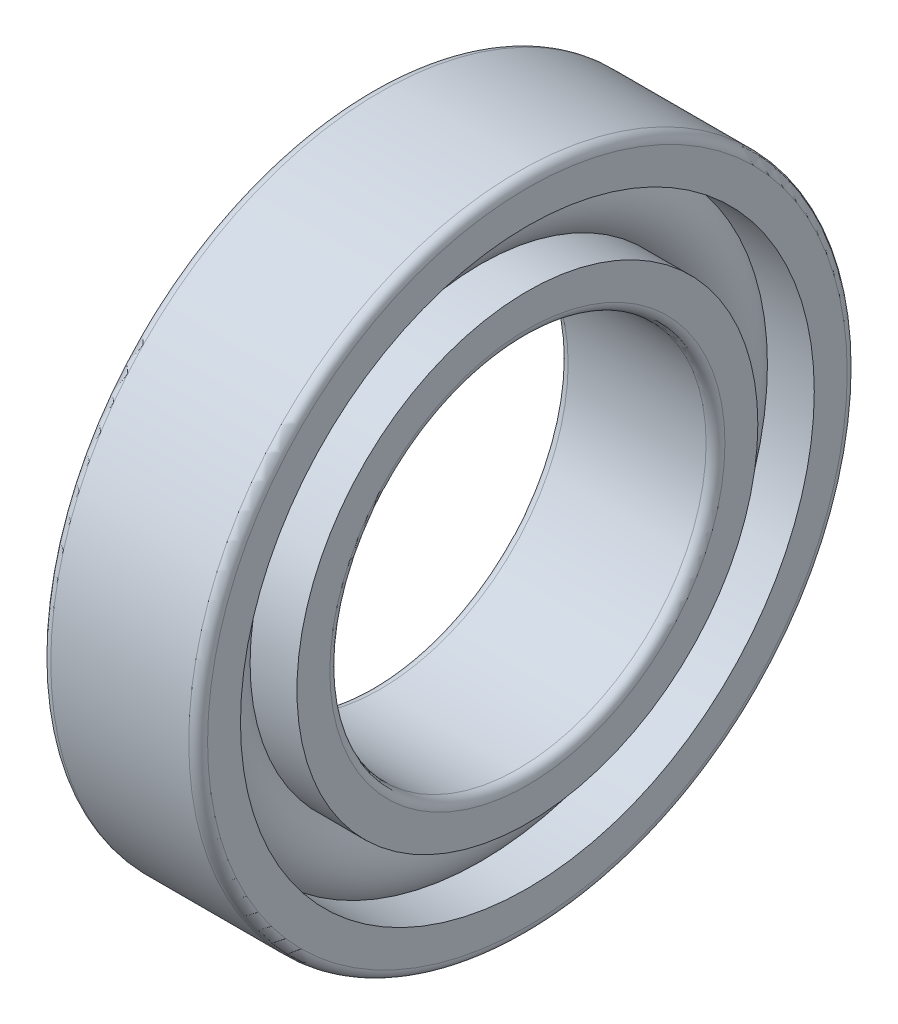
ISO-10303-21;
HEADER;
FILE_DESCRIPTION(('STEP AP214'),'2;1');
FILE_NAME('part.step','',(''),(''),'','','');
FILE_SCHEMA(('AUTOMOTIVE_DESIGN { 1 0 10303 214 1 1 1 1 }'));
ENDSEC;
DATA;
#1=APPLICATION_CONTEXT('core data for automotive mechanical design processes');
#2=APPLICATION_PROTOCOL_DEFINITION('international standard','automotive_design',2000,#1);
#3=PRODUCT_CONTEXT('',#1,'mechanical');
#4=PRODUCT('Part','Part','',(#3));
#5=PRODUCT_RELATED_PRODUCT_CATEGORY('part','',(#4));
#6=PRODUCT_DEFINITION_FORMATION('','',#4);
#7=PRODUCT_DEFINITION_CONTEXT('part definition',#1,'design');
#8=PRODUCT_DEFINITION('design','',#6,#7);
#9=PRODUCT_DEFINITION_SHAPE('','',#8);
#10=(LENGTH_UNIT() NAMED_UNIT(*) SI_UNIT(.MILLI.,.METRE.));
#11=(NAMED_UNIT(*) PLANE_ANGLE_UNIT() SI_UNIT($,.RADIAN.));
#12=(NAMED_UNIT(*) SI_UNIT($,.STERADIAN.) SOLID_ANGLE_UNIT());
#13=UNCERTAINTY_MEASURE_WITH_UNIT(LENGTH_MEASURE(1.E-05),#10,'distance_accuracy_value','');
#14=(GEOMETRIC_REPRESENTATION_CONTEXT(3) GLOBAL_UNCERTAINTY_ASSIGNED_CONTEXT((#13)) GLOBAL_UNIT_ASSIGNED_CONTEXT((#10,
#11,#12)) REPRESENTATION_CONTEXT('',''));
#15=CARTESIAN_POINT('',(0.,0.,0.));
#16=DIRECTION('',(0.,0.,1.));
#17=DIRECTION('',(1.,0.,0.));
#18=AXIS2_PLACEMENT_3D('',#15,#16,#17);
#19=CARTESIAN_POINT('',(0.,0.,0.));
#20=DIRECTION('',(-1.,0.,0.));
#21=DIRECTION('',(0.,0.,1.));
#22=AXIS2_PLACEMENT_3D('',#19,#20,#21);
#23=TOROIDAL_SURFACE('',#22,8.25,1.35);
#24=CARTESIAN_POINT('',(1.0062305898749,0.,0.));
#25=DIRECTION('',(-1.,0.,0.));
#26=DIRECTION('',(0.,0.,1.));
#27=AXIS2_PLACEMENT_3D('',#24,#25,#26);
#28=CIRCLE('',#27,9.15000000000001);
#29=CARTESIAN_POINT('',(1.0062305898749,0.,9.15000000000001));
#30=VERTEX_POINT('',#29);
#31=EDGE_CURVE('E34',#30,#30,#28,.F.);
#32=ORIENTED_EDGE('',*,*,#31,.T.);
#33=EDGE_LOOP('',(#32));
#34=FACE_BOUND('',#33,.T.);
#35=CARTESIAN_POINT('',(1.0062305898749,0.,0.));
#36=DIRECTION('',(-1.,0.,0.));
#37=DIRECTION('',(0.,0.,1.));
#38=AXIS2_PLACEMENT_3D('',#35,#36,#37);
#39=CIRCLE('',#38,7.35);
#40=CARTESIAN_POINT('',(1.0062305898749,0.,7.35));
#41=VERTEX_POINT('',#40);
#42=EDGE_CURVE('E10',#41,#41,#39,.T.);
#43=ORIENTED_EDGE('',*,*,#42,.T.);
#44=EDGE_LOOP('',(#43));
#45=FACE_BOUND('',#44,.T.);
#46=ADVANCED_FACE('F30',(#34,#45),#23,.T.);
#47=CARTESIAN_POINT('',(-20.6375,0.,0.));
#48=DIRECTION('',(1.,0.,0.));
#49=DIRECTION('',(0.,0.,-1.));
#50=AXIS2_PLACEMENT_3D('',#47,#48,#49);
#51=CYLINDRICAL_SURFACE('',#50,7.35);
#52=CARTESIAN_POINT('',(2.5,0.,0.));
#53=DIRECTION('',(1.,0.,0.));
#54=DIRECTION('',(0.,0.,-1.));
#55=AXIS2_PLACEMENT_3D('',#52,#53,#54);
#56=CIRCLE('',#55,7.35);
#57=CARTESIAN_POINT('',(2.5,0.,-7.35));
#58=VERTEX_POINT('',#57);
#59=EDGE_CURVE('E43',#58,#58,#56,.T.);
#60=ORIENTED_EDGE('',*,*,#59,.F.);
#61=EDGE_LOOP('',(#60));
#62=FACE_BOUND('',#61,.T.);
#63=ORIENTED_EDGE('',*,*,#42,.F.);
#64=EDGE_LOOP('',(#63));
#65=FACE_BOUND('',#64,.T.);
#66=ADVANCED_FACE('F82',(#62,#65),#51,.T.);
#67=CARTESIAN_POINT('',(-20.6375,0.,0.));
#68=DIRECTION('',(1.,0.,0.));
#69=DIRECTION('',(0.,0.,-1.));
#70=AXIS2_PLACEMENT_3D('',#67,#68,#69);
#71=CYLINDRICAL_SURFACE('',#70,7.35);
#72=CARTESIAN_POINT('',(-2.5,0.,0.));
#73=DIRECTION('',(1.,0.,0.));
#74=DIRECTION('',(0.,0.,-1.));
#75=AXIS2_PLACEMENT_3D('',#72,#73,#74);
#76=CIRCLE('',#75,7.35);
#77=CARTESIAN_POINT('',(-2.5,0.,-7.35));
#78=VERTEX_POINT('',#77);
#79=EDGE_CURVE('E52',#78,#78,#76,.T.);
#80=ORIENTED_EDGE('',*,*,#79,.T.);
#81=EDGE_LOOP('',(#80));
#82=FACE_BOUND('',#81,.T.);
#83=CARTESIAN_POINT('',(-1.0062305898749,0.,0.));
#84=DIRECTION('',(1.,0.,0.));
#85=DIRECTION('',(0.,0.,-1.));
#86=AXIS2_PLACEMENT_3D('',#83,#84,#85);
#87=CIRCLE('',#86,7.35);
#88=CARTESIAN_POINT('',(-1.0062305898749,0.,-7.35));
#89=VERTEX_POINT('',#88);
#90=EDGE_CURVE('E38',#89,#89,#87,.T.);
#91=ORIENTED_EDGE('',*,*,#90,.F.);
#92=EDGE_LOOP('',(#91));
#93=FACE_BOUND('',#92,.T.);
#94=ADVANCED_FACE('F85',(#82,#93),#71,.T.);
#95=CARTESIAN_POINT('',(2.5,6.3,0.));
#96=DIRECTION('',(1.,0.,0.));
#97=DIRECTION('',(0.,0.,-1.));
#98=AXIS2_PLACEMENT_3D('',#95,#96,#97);
#99=PLANE('',#98);
#100=ORIENTED_EDGE('',*,*,#59,.T.);
#101=EDGE_LOOP('',(#100));
#102=FACE_BOUND('',#101,.T.);
#103=CARTESIAN_POINT('',(2.5,0.,0.));
#104=DIRECTION('',(1.,0.,0.));
#105=DIRECTION('',(0.,0.,-1.));
#106=AXIS2_PLACEMENT_3D('',#103,#104,#105);
#107=CIRCLE('',#106,6.3);
#108=CARTESIAN_POINT('',(2.5,0.,-6.3));
#109=VERTEX_POINT('',#108);
#110=EDGE_CURVE('E74',#109,#109,#107,.T.);
#111=ORIENTED_EDGE('',*,*,#110,.F.);
#112=EDGE_LOOP('',(#111));
#113=FACE_BOUND('',#112,.T.);
#114=ADVANCED_FACE('F79',(#102,#113),#99,.T.);
#115=CARTESIAN_POINT('',(2.2,0.,0.));
#116=DIRECTION('',(1.,0.,0.));
#117=DIRECTION('',(0.,0.,-1.));
#118=AXIS2_PLACEMENT_3D('',#115,#116,#117);
#119=TOROIDAL_SURFACE('',#118,6.3,0.3);
#120=ORIENTED_EDGE('',*,*,#110,.T.);
#121=EDGE_LOOP('',(#120));
#122=FACE_BOUND('',#121,.T.);
#123=CARTESIAN_POINT('',(2.2,0.,0.));
#124=DIRECTION('',(1.,0.,0.));
#125=DIRECTION('',(0.,0.,-1.));
#126=AXIS2_PLACEMENT_3D('',#123,#124,#125);
#127=CIRCLE('',#126,6.);
#128=CARTESIAN_POINT('',(2.2,0.,-6.));
#129=VERTEX_POINT('',#128);
#130=EDGE_CURVE('E71',#129,#129,#127,.T.);
#131=ORIENTED_EDGE('',*,*,#130,.F.);
#132=EDGE_LOOP('',(#131));
#133=FACE_BOUND('',#132,.T.);
#134=ADVANCED_FACE('F96',(#122,#133),#119,.T.);
#135=CARTESIAN_POINT('',(-20.6375,0.,0.));
#136=DIRECTION('',(1.,0.,0.));
#137=DIRECTION('',(0.,0.,-1.));
#138=AXIS2_PLACEMENT_3D('',#135,#136,#137);
#139=CYLINDRICAL_SURFACE('',#138,6.);
#140=ORIENTED_EDGE('',*,*,#130,.T.);
#141=EDGE_LOOP('',(#140));
#142=FACE_BOUND('',#141,.T.);
#143=CARTESIAN_POINT('',(-2.2,0.,0.));
#144=DIRECTION('',(1.,0.,0.));
#145=DIRECTION('',(0.,0.,-1.));
#146=AXIS2_PLACEMENT_3D('',#143,#144,#145);
#147=CIRCLE('',#146,6.);
#148=CARTESIAN_POINT('',(-2.2,0.,-6.));
#149=VERTEX_POINT('',#148);
#150=EDGE_CURVE('E68',#149,#149,#147,.T.);
#151=ORIENTED_EDGE('',*,*,#150,.F.);
#152=EDGE_LOOP('',(#151));
#153=FACE_BOUND('',#152,.T.);
#154=ADVANCED_FACE('F99',(#142,#153),#139,.F.);
#155=CARTESIAN_POINT('',(-2.2,0.,0.));
#156=DIRECTION('',(1.,0.,0.));
#157=DIRECTION('',(0.,0.,-1.));
#158=AXIS2_PLACEMENT_3D('',#155,#156,#157);
#159=TOROIDAL_SURFACE('',#158,6.3,0.3);
#160=ORIENTED_EDGE('',*,*,#150,.T.);
#161=EDGE_LOOP('',(#160));
#162=FACE_BOUND('',#161,.T.);
#163=CARTESIAN_POINT('',(-2.5,0.,0.));
#164=DIRECTION('',(1.,0.,0.));
#165=DIRECTION('',(0.,0.,-1.));
#166=AXIS2_PLACEMENT_3D('',#163,#164,#165);
#167=CIRCLE('',#166,6.3);
#168=CARTESIAN_POINT('',(-2.5,0.,-6.3));
#169=VERTEX_POINT('',#168);
#170=EDGE_CURVE('E65',#169,#169,#167,.T.);
#171=ORIENTED_EDGE('',*,*,#170,.F.);
#172=EDGE_LOOP('',(#171));
#173=FACE_BOUND('',#172,.T.);
#174=ADVANCED_FACE('F103',(#162,#173),#159,.T.);
#175=CARTESIAN_POINT('',(-2.5,7.35,0.));
#176=DIRECTION('',(-1.,0.,0.));
#177=DIRECTION('',(0.,0.,1.));
#178=AXIS2_PLACEMENT_3D('',#175,#176,#177);
#179=PLANE('',#178);
#180=ORIENTED_EDGE('',*,*,#170,.T.);
#181=EDGE_LOOP('',(#180));
#182=FACE_BOUND('',#181,.T.);
#183=ORIENTED_EDGE('',*,*,#79,.F.);
#184=EDGE_LOOP('',(#183));
#185=FACE_BOUND('',#184,.T.);
#186=ADVANCED_FACE('F107',(#182,#185),#179,.T.);
#187=CARTESIAN_POINT('',(-1.0062305898749,0.,0.));
#188=DIRECTION('',(1.,0.,0.));
#189=DIRECTION('',(0.,0.,-1.));
#190=AXIS2_PLACEMENT_3D('',#187,#188,#189);
#191=CIRCLE('',#190,9.15000000000001);
#192=CARTESIAN_POINT('',(-1.0062305898749,0.,-9.15000000000001));
#193=VERTEX_POINT('',#192);
#194=EDGE_CURVE('E46',#193,#193,#191,.F.);
#195=ORIENTED_EDGE('',*,*,#194,.T.);
#196=EDGE_LOOP('',(#195));
#197=FACE_BOUND('',#196,.T.);
#198=ORIENTED_EDGE('',*,*,#90,.T.);
#199=EDGE_LOOP('',(#198));
#200=FACE_BOUND('',#199,.T.);
#201=ADVANCED_FACE('F32',(#197,#200),#23,.T.);
#202=CARTESIAN_POINT('',(-20.6375,0.,0.));
#203=DIRECTION('',(1.,0.,0.));
#204=DIRECTION('',(0.,0.,-1.));
#205=AXIS2_PLACEMENT_3D('',#202,#203,#204);
#206=CYLINDRICAL_SURFACE('',#205,9.15000000000001);
#207=CARTESIAN_POINT('',(2.5,0.,0.));
#208=DIRECTION('',(1.,0.,0.));
#209=DIRECTION('',(0.,0.,-1.));
#210=AXIS2_PLACEMENT_3D('',#207,#208,#209);
#211=CIRCLE('',#210,9.15000000000001);
#212=CARTESIAN_POINT('',(2.5,0.,-9.15000000000001));
#213=VERTEX_POINT('',#212);
#214=EDGE_CURVE('E48',#213,#213,#211,.T.);
#215=ORIENTED_EDGE('',*,*,#214,.T.);
#216=EDGE_LOOP('',(#215));
#217=FACE_BOUND('',#216,.T.);
#218=ORIENTED_EDGE('',*,*,#31,.F.);
#219=EDGE_LOOP('',(#218));
#220=FACE_BOUND('',#219,.T.);
#221=ADVANCED_FACE('F112',(#217,#220),#206,.F.);
#222=CARTESIAN_POINT('',(-20.6375,0.,0.));
#223=DIRECTION('',(1.,0.,0.));
#224=DIRECTION('',(0.,0.,-1.));
#225=AXIS2_PLACEMENT_3D('',#222,#223,#224);
#226=CYLINDRICAL_SURFACE('',#225,9.15000000000001);
#227=CARTESIAN_POINT('',(-2.5,0.,0.));
#228=DIRECTION('',(1.,0.,0.));
#229=DIRECTION('',(0.,0.,-1.));
#230=AXIS2_PLACEMENT_3D('',#227,#228,#229);
#231=CIRCLE('',#230,9.15000000000001);
#232=CARTESIAN_POINT('',(-2.5,0.,-9.15000000000001));
#233=VERTEX_POINT('',#232);
#234=EDGE_CURVE('E143',#233,#233,#231,.T.);
#235=ORIENTED_EDGE('',*,*,#234,.F.);
#236=EDGE_LOOP('',(#235));
#237=FACE_BOUND('',#236,.T.);
#238=ORIENTED_EDGE('',*,*,#194,.F.);
#239=EDGE_LOOP('',(#238));
#240=FACE_BOUND('',#239,.T.);
#241=ADVANCED_FACE('F115',(#237,#240),#226,.F.);
#242=CARTESIAN_POINT('',(2.5,10.2,0.));
#243=DIRECTION('',(1.,0.,0.));
#244=DIRECTION('',(0.,0.,-1.));
#245=AXIS2_PLACEMENT_3D('',#242,#243,#244);
#246=PLANE('',#245);
#247=CARTESIAN_POINT('',(2.5,0.,0.));
#248=DIRECTION('',(1.,0.,0.));
#249=DIRECTION('',(0.,0.,-1.));
#250=AXIS2_PLACEMENT_3D('',#247,#248,#249);
#251=CIRCLE('',#250,10.2);
#252=CARTESIAN_POINT('',(2.5,0.,-10.2));
#253=VERTEX_POINT('',#252);
#254=EDGE_CURVE('E54',#253,#253,#251,.T.);
#255=ORIENTED_EDGE('',*,*,#254,.T.);
#256=EDGE_LOOP('',(#255));
#257=FACE_BOUND('',#256,.T.);
#258=ORIENTED_EDGE('',*,*,#214,.F.);
#259=EDGE_LOOP('',(#258));
#260=FACE_BOUND('',#259,.T.);
#261=ADVANCED_FACE('F116',(#257,#260),#246,.T.);
#262=CARTESIAN_POINT('',(2.2,0.,0.));
#263=DIRECTION('',(1.,0.,0.));
#264=DIRECTION('',(0.,0.,-1.));
#265=AXIS2_PLACEMENT_3D('',#262,#263,#264);
#266=TOROIDAL_SURFACE('',#265,10.2,0.3);
#267=CARTESIAN_POINT('',(2.2,0.,0.));
#268=DIRECTION('',(1.,0.,0.));
#269=DIRECTION('',(0.,0.,-1.));
#270=AXIS2_PLACEMENT_3D('',#267,#268,#269);
#271=CIRCLE('',#270,10.5);
#272=CARTESIAN_POINT('',(2.2,0.,-10.5));
#273=VERTEX_POINT('',#272);
#274=EDGE_CURVE('E59',#273,#273,#271,.T.);
#275=ORIENTED_EDGE('',*,*,#274,.T.);
#276=EDGE_LOOP('',(#275));
#277=FACE_BOUND('',#276,.T.);
#278=ORIENTED_EDGE('',*,*,#254,.F.);
#279=EDGE_LOOP('',(#278));
#280=FACE_BOUND('',#279,.T.);
#281=ADVANCED_FACE('F119',(#277,#280),#266,.T.);
#282=CARTESIAN_POINT('',(-20.6375,0.,0.));
#283=DIRECTION('',(1.,0.,0.));
#284=DIRECTION('',(0.,0.,-1.));
#285=AXIS2_PLACEMENT_3D('',#282,#283,#284);
#286=CYLINDRICAL_SURFACE('',#285,10.5);
#287=CARTESIAN_POINT('',(-2.2,0.,0.));
#288=DIRECTION('',(1.,0.,0.));
#289=DIRECTION('',(0.,0.,-1.));
#290=AXIS2_PLACEMENT_3D('',#287,#288,#289);
#291=CIRCLE('',#290,10.5);
#292=CARTESIAN_POINT('',(-2.2,0.,-10.5));
#293=VERTEX_POINT('',#292);
#294=EDGE_CURVE('E147',#293,#293,#291,.T.);
#295=ORIENTED_EDGE('',*,*,#294,.T.);
#296=EDGE_LOOP('',(#295));
#297=FACE_BOUND('',#296,.T.);
#298=ORIENTED_EDGE('',*,*,#274,.F.);
#299=EDGE_LOOP('',(#298));
#300=FACE_BOUND('',#299,.T.);
#301=ADVANCED_FACE('F123',(#297,#300),#286,.T.);
#302=CARTESIAN_POINT('',(-2.2,0.,0.));
#303=DIRECTION('',(1.,0.,0.));
#304=DIRECTION('',(0.,0.,-1.));
#305=AXIS2_PLACEMENT_3D('',#302,#303,#304);
#306=TOROIDAL_SURFACE('',#305,10.2,0.3);
#307=CARTESIAN_POINT('',(-2.5,0.,0.));
#308=DIRECTION('',(1.,0.,0.));
#309=DIRECTION('',(0.,0.,-1.));
#310=AXIS2_PLACEMENT_3D('',#307,#308,#309);
#311=CIRCLE('',#310,10.2);
#312=CARTESIAN_POINT('',(-2.5,0.,-10.2));
#313=VERTEX_POINT('',#312);
#314=EDGE_CURVE('E144',#313,#313,#311,.T.);
#315=ORIENTED_EDGE('',*,*,#314,.T.);
#316=EDGE_LOOP('',(#315));
#317=FACE_BOUND('',#316,.T.);
#318=ORIENTED_EDGE('',*,*,#294,.F.);
#319=EDGE_LOOP('',(#318));
#320=FACE_BOUND('',#319,.T.);
#321=ADVANCED_FACE('F127',(#317,#320),#306,.T.);
#322=CARTESIAN_POINT('',(-2.5,9.15000000000001,0.));
#323=DIRECTION('',(-1.,0.,0.));
#324=DIRECTION('',(0.,0.,1.));
#325=AXIS2_PLACEMENT_3D('',#322,#323,#324);
#326=PLANE('',#325);
#327=ORIENTED_EDGE('',*,*,#234,.T.);
#328=EDGE_LOOP('',(#327));
#329=FACE_BOUND('',#328,.T.);
#330=ORIENTED_EDGE('',*,*,#314,.F.);
#331=EDGE_LOOP('',(#330));
#332=FACE_BOUND('',#331,.T.);
#333=ADVANCED_FACE('F131',(#329,#332),#326,.T.);
#334=CLOSED_SHELL('',(#46,#66,#94,#114,#134,#154,#174,#186,#201,#221,#241,#261,#281,#301,#321,#333));
#335=MANIFOLD_SOLID_BREP('B2',#334);
#336=ADVANCED_BREP_SHAPE_REPRESENTATION('',(#18,#335),#14);
#337=SHAPE_DEFINITION_REPRESENTATION(#9,#336);
ENDSEC;
END-ISO-10303-21;
